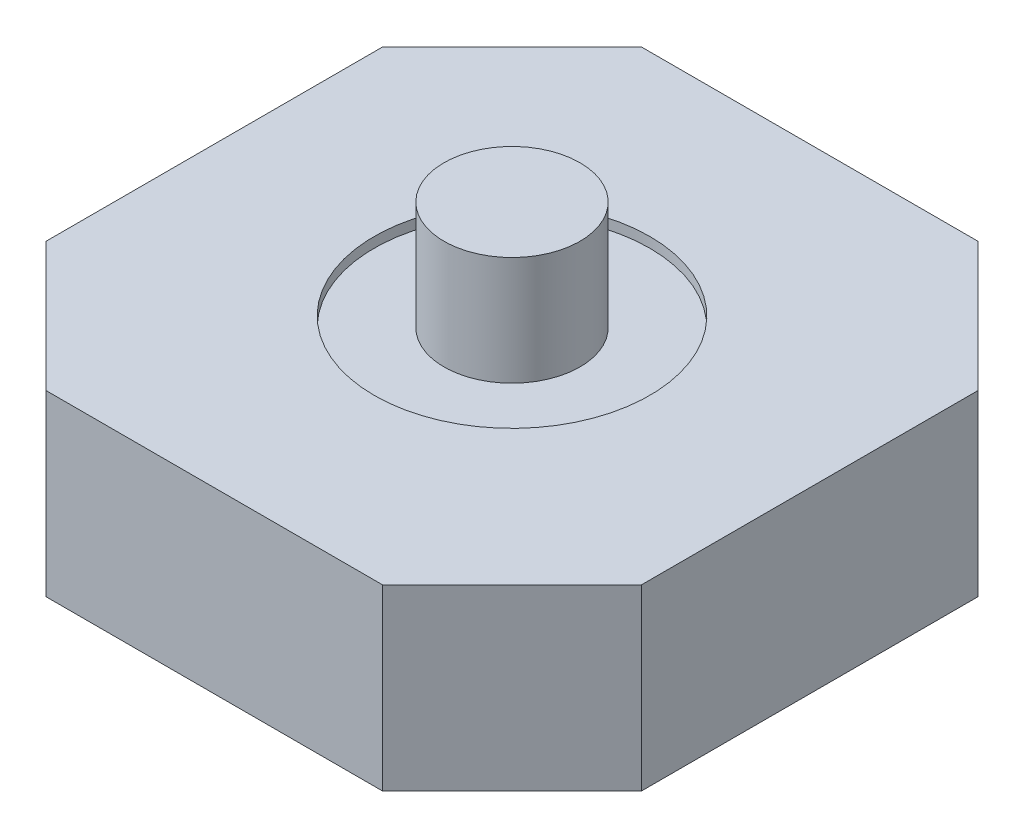
ISO-10303-21;
HEADER;
FILE_DESCRIPTION(('STEP AP214'),'2;1');
FILE_NAME('part.step','',(''),(''),'','','');
FILE_SCHEMA(('AUTOMOTIVE_DESIGN { 1 0 10303 214 1 1 1 1 }'));
ENDSEC;
DATA;
#1=APPLICATION_CONTEXT('core data for automotive mechanical design processes');
#2=APPLICATION_PROTOCOL_DEFINITION('international standard','automotive_design',2000,#1);
#3=PRODUCT_CONTEXT('',#1,'mechanical');
#4=PRODUCT('Part','Part','',(#3));
#5=PRODUCT_RELATED_PRODUCT_CATEGORY('part','',(#4));
#6=PRODUCT_DEFINITION_FORMATION('','',#4);
#7=PRODUCT_DEFINITION_CONTEXT('part definition',#1,'design');
#8=PRODUCT_DEFINITION('design','',#6,#7);
#9=PRODUCT_DEFINITION_SHAPE('','',#8);
#10=(LENGTH_UNIT() NAMED_UNIT(*) SI_UNIT(.MILLI.,.METRE.));
#11=(NAMED_UNIT(*) PLANE_ANGLE_UNIT() SI_UNIT($,.RADIAN.));
#12=(NAMED_UNIT(*) SI_UNIT($,.STERADIAN.) SOLID_ANGLE_UNIT());
#13=UNCERTAINTY_MEASURE_WITH_UNIT(LENGTH_MEASURE(1.E-05),#10,'distance_accuracy_value','');
#14=(GEOMETRIC_REPRESENTATION_CONTEXT(3) GLOBAL_UNCERTAINTY_ASSIGNED_CONTEXT((#13)) GLOBAL_UNIT_ASSIGNED_CONTEXT((#10,
#11,#12)) REPRESENTATION_CONTEXT('',''));
#15=CARTESIAN_POINT('',(0.,0.,0.));
#16=DIRECTION('',(0.,0.,1.));
#17=DIRECTION('',(1.,0.,0.));
#18=AXIS2_PLACEMENT_3D('',#15,#16,#17);
#19=CARTESIAN_POINT('',(-15.78143071355,8.15,-21.64323730767));
#20=DIRECTION('',(0.,1.,0.));
#21=DIRECTION('',(0.,0.,1.));
#22=AXIS2_PLACEMENT_3D('',#19,#20,#21);
#23=PLANE('',#22);
#24=CARTESIAN_POINT('',(-15.78143071355,8.15,-21.64323730767));
#25=DIRECTION('',(0.,-1.,0.));
#26=DIRECTION('',(0.,0.,-1.));
#27=AXIS2_PLACEMENT_3D('',#24,#25,#26);
#28=CIRCLE('',#27,2.);
#29=CARTESIAN_POINT('',(-15.78143071355,8.15,-23.64323730767));
#30=VERTEX_POINT('',#29);
#31=EDGE_CURVE('E19',#30,#30,#28,.T.);
#32=ORIENTED_EDGE('',*,*,#31,.F.);
#33=EDGE_LOOP('',(#32));
#34=FACE_BOUND('',#33,.T.);
#35=ADVANCED_FACE('F16',(#34),#23,.T.);
#36=CARTESIAN_POINT('',(-15.78143071355,8.15,-21.64323730767));
#37=DIRECTION('',(0.,-1.,0.));
#38=DIRECTION('',(0.,0.,-1.));
#39=AXIS2_PLACEMENT_3D('',#36,#37,#38);
#40=CYLINDRICAL_SURFACE('',#39,2.);
#41=CARTESIAN_POINT('',(-15.78143071355,4.95,-21.64323730767));
#42=DIRECTION('',(0.,-1.,0.));
#43=DIRECTION('',(0.,0.,-1.));
#44=AXIS2_PLACEMENT_3D('',#41,#42,#43);
#45=CIRCLE('',#44,2.);
#46=CARTESIAN_POINT('',(-15.78143071355,4.95,-23.64323730767));
#47=VERTEX_POINT('',#46);
#48=EDGE_CURVE('E109',#47,#47,#45,.T.);
#49=ORIENTED_EDGE('',*,*,#48,.F.);
#50=EDGE_LOOP('',(#49));
#51=FACE_BOUND('',#50,.T.);
#52=ORIENTED_EDGE('',*,*,#31,.T.);
#53=EDGE_LOOP('',(#52));
#54=FACE_BOUND('',#53,.T.);
#55=ADVANCED_FACE('F116',(#51,#54),#40,.T.);
#56=CARTESIAN_POINT('',(-15.78143071355,4.95,-21.64323730767));
#57=DIRECTION('',(0.,1.,0.));
#58=DIRECTION('',(0.,0.,1.));
#59=AXIS2_PLACEMENT_3D('',#56,#57,#58);
#60=PLANE('',#59);
#61=CARTESIAN_POINT('',(-15.78143071355,4.95,-21.64323730767));
#62=DIRECTION('',(0.,1.,0.));
#63=DIRECTION('',(0.,0.,1.));
#64=AXIS2_PLACEMENT_3D('',#61,#62,#63);
#65=CIRCLE('',#64,4.05);
#66=CARTESIAN_POINT('',(-15.78143071355,4.95,-17.59323730767));
#67=VERTEX_POINT('',#66);
#68=EDGE_CURVE('E107',#67,#67,#65,.T.);
#69=ORIENTED_EDGE('',*,*,#68,.T.);
#70=EDGE_LOOP('',(#69));
#71=FACE_BOUND('',#70,.T.);
#72=ORIENTED_EDGE('',*,*,#48,.T.);
#73=EDGE_LOOP('',(#72));
#74=FACE_BOUND('',#73,.T.);
#75=ADVANCED_FACE('F123',(#71,#74),#60,.T.);
#76=CARTESIAN_POINT('',(-15.78143071355,4.95,-21.64323730767));
#77=DIRECTION('',(0.,1.,0.));
#78=DIRECTION('',(0.,0.,1.));
#79=AXIS2_PLACEMENT_3D('',#76,#77,#78);
#80=CYLINDRICAL_SURFACE('',#79,4.05);
#81=CARTESIAN_POINT('',(-15.78143071355,5.25,-21.64323730767));
#82=DIRECTION('',(0.,1.,0.));
#83=DIRECTION('',(0.,0.,1.));
#84=AXIS2_PLACEMENT_3D('',#81,#82,#83);
#85=CIRCLE('',#84,4.05);
#86=CARTESIAN_POINT('',(-15.78143071355,5.25,-17.59323730767));
#87=VERTEX_POINT('',#86);
#88=EDGE_CURVE('E90',#87,#87,#85,.F.);
#89=ORIENTED_EDGE('',*,*,#88,.F.);
#90=EDGE_LOOP('',(#89));
#91=FACE_BOUND('',#90,.T.);
#92=ORIENTED_EDGE('',*,*,#68,.F.);
#93=EDGE_LOOP('',(#92));
#94=FACE_BOUND('',#93,.T.);
#95=ADVANCED_FACE('F162',(#91,#94),#80,.F.);
#96=CARTESIAN_POINT('',(0.,5.25,0.));
#97=DIRECTION('',(0.,1.,0.));
#98=DIRECTION('',(0.,0.,1.));
#99=AXIS2_PLACEMENT_3D('',#96,#97,#98);
#100=PLANE('',#99);
#101=DIRECTION('',(0.,0.,1.));
#102=VECTOR('',#101,1.);
#103=CARTESIAN_POINT('',(-7.031430713558,5.25,-12.89323730767));
#104=LINE('',#103,#102);
#105=CARTESIAN_POINT('',(-7.031430713558,5.25,-16.69323730767));
#106=VERTEX_POINT('',#105);
#107=CARTESIAN_POINT('',(-7.031430713557,5.25,-26.593237307671));
#108=VERTEX_POINT('',#107);
#109=EDGE_CURVE('E292',#106,#108,#104,.F.);
#110=ORIENTED_EDGE('',*,*,#109,.T.);
#111=DIRECTION('',(0.707106781186548,0.,0.707106781186548));
#112=VECTOR('',#111,1.);
#113=CARTESIAN_POINT('',(-10.83143071355,5.25,-30.39323730767));
#114=LINE('',#113,#112);
#115=CARTESIAN_POINT('',(-10.83143071355,5.25,-30.39323730767));
#116=VERTEX_POINT('',#115);
#117=EDGE_CURVE('E287',#108,#116,#114,.F.);
#118=ORIENTED_EDGE('',*,*,#117,.T.);
#119=DIRECTION('',(1.,0.,0.));
#120=VECTOR('',#119,1.);
#121=CARTESIAN_POINT('',(-7.031430713558,5.25,-30.39323730767));
#122=LINE('',#121,#120);
#123=CARTESIAN_POINT('',(-20.73143071355,5.25,-30.39323730767));
#124=VERTEX_POINT('',#123);
#125=EDGE_CURVE('E282',#116,#124,#122,.F.);
#126=ORIENTED_EDGE('',*,*,#125,.T.);
#127=DIRECTION('',(0.707106781186548,0.,-0.707106781186548));
#128=VECTOR('',#127,1.);
#129=CARTESIAN_POINT('',(-24.53143071355,5.25,-26.59323730767));
#130=LINE('',#129,#128);
#131=CARTESIAN_POINT('',(-24.53143071355,5.25,-26.59323730767));
#132=VERTEX_POINT('',#131);
#133=EDGE_CURVE('E277',#124,#132,#130,.F.);
#134=ORIENTED_EDGE('',*,*,#133,.T.);
#135=DIRECTION('',(0.,0.,-1.));
#136=VECTOR('',#135,1.);
#137=CARTESIAN_POINT('',(-24.53143071355,5.25,-12.89323730767));
#138=LINE('',#137,#136);
#139=CARTESIAN_POINT('',(-24.53143071355,5.25,-16.69323730767));
#140=VERTEX_POINT('',#139);
#141=EDGE_CURVE('E84',#132,#140,#138,.F.);
#142=ORIENTED_EDGE('',*,*,#141,.T.);
#143=DIRECTION('',(-0.707106781186548,0.,-0.707106781186548));
#144=VECTOR('',#143,1.);
#145=CARTESIAN_POINT('',(-20.73143071355,5.25,-12.89323730767));
#146=LINE('',#145,#144);
#147=CARTESIAN_POINT('',(-20.73143071355,5.25,-12.89323730767));
#148=VERTEX_POINT('',#147);
#149=EDGE_CURVE('E81',#140,#148,#146,.F.);
#150=ORIENTED_EDGE('',*,*,#149,.T.);
#151=DIRECTION('',(-1.,0.,0.));
#152=VECTOR('',#151,1.);
#153=CARTESIAN_POINT('',(-7.031430713558,5.25,-12.89323730767));
#154=LINE('',#153,#152);
#155=CARTESIAN_POINT('',(-10.831430713551,5.25,-12.893237307671));
#156=VERTEX_POINT('',#155);
#157=EDGE_CURVE('E78',#148,#156,#154,.F.);
#158=ORIENTED_EDGE('',*,*,#157,.T.);
#159=DIRECTION('',(-0.707106781186548,0.,0.707106781186548));
#160=VECTOR('',#159,1.);
#161=CARTESIAN_POINT('',(-7.031430713558,5.25,-16.69323730767));
#162=LINE('',#161,#160);
#163=EDGE_CURVE('E262',#156,#106,#162,.F.);
#164=ORIENTED_EDGE('',*,*,#163,.T.);
#165=EDGE_LOOP('',(#110,#118,#126,#134,#142,#150,#158,#164));
#166=FACE_BOUND('',#165,.T.);
#167=ORIENTED_EDGE('',*,*,#88,.T.);
#168=EDGE_LOOP('',(#167));
#169=FACE_BOUND('',#168,.T.);
#170=ADVANCED_FACE('F82',(#166,#169),#100,.T.);
#171=CARTESIAN_POINT('',(-20.73143071355,5.25,-12.89323730767));
#172=DIRECTION('',(0.707106781186548,0.,-0.707106781186548));
#173=DIRECTION('',(-0.707106781186548,0.,-0.707106781186548));
#174=AXIS2_PLACEMENT_3D('',#171,#172,#173);
#175=PLANE('',#174);
#176=DIRECTION('',(0.,1.,0.));
#177=VECTOR('',#176,1.);
#178=CARTESIAN_POINT('',(-24.53143071355,5.25,-16.69323730767));
#179=LINE('',#178,#177);
#180=CARTESIAN_POINT('',(-24.53143071355,0.,-16.69323730767));
#181=VERTEX_POINT('',#180);
#182=EDGE_CURVE('E275',#140,#181,#179,.F.);
#183=ORIENTED_EDGE('',*,*,#182,.T.);
#184=DIRECTION('',(0.707106781186548,0.,0.707106781186547));
#185=VECTOR('',#184,1.);
#186=CARTESIAN_POINT('',(-24.53143071355,0.,-16.69323730767));
#187=LINE('',#186,#185);
#188=CARTESIAN_POINT('',(-20.73143071355,0.,-12.89323730767));
#189=VERTEX_POINT('',#188);
#190=EDGE_CURVE('E101',#181,#189,#187,.T.);
#191=ORIENTED_EDGE('',*,*,#190,.T.);
#192=DIRECTION('',(0.,1.,0.));
#193=VECTOR('',#192,1.);
#194=CARTESIAN_POINT('',(-20.73143071355,5.25,-12.89323730767));
#195=LINE('',#194,#193);
#196=EDGE_CURVE('E89',#189,#148,#195,.T.);
#197=ORIENTED_EDGE('',*,*,#196,.T.);
#198=ORIENTED_EDGE('',*,*,#149,.F.);
#199=EDGE_LOOP('',(#183,#191,#197,#198));
#200=FACE_BOUND('',#199,.T.);
#201=ADVANCED_FACE('F100',(#200),#175,.F.);
#202=CARTESIAN_POINT('',(-7.031430713558,5.25,-12.89323730767));
#203=DIRECTION('',(0.,0.,-1.));
#204=DIRECTION('',(-1.,0.,0.));
#205=AXIS2_PLACEMENT_3D('',#202,#203,#204);
#206=PLANE('',#205);
#207=ORIENTED_EDGE('',*,*,#196,.F.);
#208=DIRECTION('',(1.,0.,0.));
#209=VECTOR('',#208,1.);
#210=CARTESIAN_POINT('',(0.,0.,-12.89323730767));
#211=LINE('',#210,#209);
#212=CARTESIAN_POINT('',(-10.831430713551,0.,-12.893237307671));
#213=VERTEX_POINT('',#212);
#214=EDGE_CURVE('E264',#189,#213,#211,.T.);
#215=ORIENTED_EDGE('',*,*,#214,.T.);
#216=DIRECTION('',(0.,1.,0.));
#217=VECTOR('',#216,1.);
#218=CARTESIAN_POINT('',(-10.831430713554,5.25,-12.893237307674));
#219=LINE('',#218,#217);
#220=EDGE_CURVE('E97',#213,#156,#219,.T.);
#221=ORIENTED_EDGE('',*,*,#220,.T.);
#222=ORIENTED_EDGE('',*,*,#157,.F.);
#223=EDGE_LOOP('',(#207,#215,#221,#222));
#224=FACE_BOUND('',#223,.T.);
#225=ADVANCED_FACE('F94',(#224),#206,.F.);
#226=CARTESIAN_POINT('',(-7.031430713558,5.25,-16.69323730767));
#227=DIRECTION('',(-0.707106781186548,0.,-0.707106781186548));
#228=DIRECTION('',(-0.707106781186548,0.,0.707106781186548));
#229=AXIS2_PLACEMENT_3D('',#226,#227,#228);
#230=PLANE('',#229);
#231=ORIENTED_EDGE('',*,*,#220,.F.);
#232=DIRECTION('',(0.707106781185803,0.,-0.707106781187292));
#233=VECTOR('',#232,1.);
#234=CARTESIAN_POINT('',(-10.83143071355,0.,-12.89323730767));
#235=LINE('',#234,#233);
#236=CARTESIAN_POINT('',(-7.031430713558,0.,-16.69323730767));
#237=VERTEX_POINT('',#236);
#238=EDGE_CURVE('E261',#213,#237,#235,.T.);
#239=ORIENTED_EDGE('',*,*,#238,.T.);
#240=DIRECTION('',(0.,1.,0.));
#241=VECTOR('',#240,1.);
#242=CARTESIAN_POINT('',(-7.031430713558,5.25,-16.69323730767));
#243=LINE('',#242,#241);
#244=EDGE_CURVE('E294',#237,#106,#243,.T.);
#245=ORIENTED_EDGE('',*,*,#244,.T.);
#246=ORIENTED_EDGE('',*,*,#163,.F.);
#247=EDGE_LOOP('',(#231,#239,#245,#246));
#248=FACE_BOUND('',#247,.T.);
#249=ADVANCED_FACE('F151',(#248),#230,.F.);
#250=CARTESIAN_POINT('',(-7.031430713558,5.25,-12.89323730767));
#251=DIRECTION('',(-1.,0.,0.));
#252=DIRECTION('',(0.,0.,1.));
#253=AXIS2_PLACEMENT_3D('',#250,#251,#252);
#254=PLANE('',#253);
#255=DIRECTION('',(0.,1.,0.));
#256=VECTOR('',#255,1.);
#257=CARTESIAN_POINT('',(-7.031430713554,5.25,-26.593237307674));
#258=LINE('',#257,#256);
#259=CARTESIAN_POINT('',(-7.031430713557,0.,-26.593237307671));
#260=VERTEX_POINT('',#259);
#261=EDGE_CURVE('E289',#260,#108,#258,.T.);
#262=ORIENTED_EDGE('',*,*,#261,.T.);
#263=ORIENTED_EDGE('',*,*,#109,.F.);
#264=ORIENTED_EDGE('',*,*,#244,.F.);
#265=DIRECTION('',(0.,0.,1.));
#266=VECTOR('',#265,1.);
#267=CARTESIAN_POINT('',(-7.031430713558,0.,0.));
#268=LINE('',#267,#266);
#269=EDGE_CURVE('E267',#237,#260,#268,.F.);
#270=ORIENTED_EDGE('',*,*,#269,.T.);
#271=EDGE_LOOP('',(#262,#263,#264,#270));
#272=FACE_BOUND('',#271,.T.);
#273=ADVANCED_FACE('F147',(#272),#254,.F.);
#274=CARTESIAN_POINT('',(-10.83143071355,5.25,-30.39323730767));
#275=DIRECTION('',(-0.707106781186548,0.,0.707106781186548));
#276=DIRECTION('',(0.707106781186548,0.,0.707106781186548));
#277=AXIS2_PLACEMENT_3D('',#274,#275,#276);
#278=PLANE('',#277);
#279=ORIENTED_EDGE('',*,*,#261,.F.);
#280=DIRECTION('',(-0.707106781185804,0.,-0.707106781187292));
#281=VECTOR('',#280,1.);
#282=CARTESIAN_POINT('',(-7.031430713558,0.,-26.59323730767));
#283=LINE('',#282,#281);
#284=CARTESIAN_POINT('',(-10.83143071355,0.,-30.39323730767));
#285=VERTEX_POINT('',#284);
#286=EDGE_CURVE('E299',#260,#285,#283,.T.);
#287=ORIENTED_EDGE('',*,*,#286,.T.);
#288=DIRECTION('',(0.,1.,0.));
#289=VECTOR('',#288,1.);
#290=CARTESIAN_POINT('',(-10.83143071355,5.25,-30.39323730767));
#291=LINE('',#290,#289);
#292=EDGE_CURVE('E284',#285,#116,#291,.T.);
#293=ORIENTED_EDGE('',*,*,#292,.T.);
#294=ORIENTED_EDGE('',*,*,#117,.F.);
#295=EDGE_LOOP('',(#279,#287,#293,#294));
#296=FACE_BOUND('',#295,.T.);
#297=ADVANCED_FACE('F143',(#296),#278,.F.);
#298=CARTESIAN_POINT('',(-7.031430713558,5.25,-30.39323730767));
#299=DIRECTION('',(0.,0.,1.));
#300=DIRECTION('',(1.,0.,0.));
#301=AXIS2_PLACEMENT_3D('',#298,#299,#300);
#302=PLANE('',#301);
#303=DIRECTION('',(0.,1.,0.));
#304=VECTOR('',#303,1.);
#305=CARTESIAN_POINT('',(-20.73143071355,5.25,-30.39323730767));
#306=LINE('',#305,#304);
#307=CARTESIAN_POINT('',(-20.73143071355,0.,-30.39323730767));
#308=VERTEX_POINT('',#307);
#309=EDGE_CURVE('E279',#308,#124,#306,.T.);
#310=ORIENTED_EDGE('',*,*,#309,.T.);
#311=ORIENTED_EDGE('',*,*,#125,.F.);
#312=ORIENTED_EDGE('',*,*,#292,.F.);
#313=DIRECTION('',(1.,0.,0.));
#314=VECTOR('',#313,1.);
#315=CARTESIAN_POINT('',(0.,0.,-30.39323730767));
#316=LINE('',#315,#314);
#317=EDGE_CURVE('E302',#285,#308,#316,.F.);
#318=ORIENTED_EDGE('',*,*,#317,.T.);
#319=EDGE_LOOP('',(#310,#311,#312,#318));
#320=FACE_BOUND('',#319,.T.);
#321=ADVANCED_FACE('F139',(#320),#302,.F.);
#322=CARTESIAN_POINT('',(-24.53143071355,5.25,-26.59323730767));
#323=DIRECTION('',(0.707106781186548,0.,0.707106781186548));
#324=DIRECTION('',(0.707106781186548,0.,-0.707106781186548));
#325=AXIS2_PLACEMENT_3D('',#322,#323,#324);
#326=PLANE('',#325);
#327=ORIENTED_EDGE('',*,*,#309,.F.);
#328=DIRECTION('',(-0.707106781186548,0.,0.707106781186547));
#329=VECTOR('',#328,1.);
#330=CARTESIAN_POINT('',(-20.73143071355,0.,-30.39323730767));
#331=LINE('',#330,#329);
#332=CARTESIAN_POINT('',(-24.53143071355,0.,-26.59323730767));
#333=VERTEX_POINT('',#332);
#334=EDGE_CURVE('E25',#308,#333,#331,.T.);
#335=ORIENTED_EDGE('',*,*,#334,.T.);
#336=DIRECTION('',(0.,1.,0.));
#337=VECTOR('',#336,1.);
#338=CARTESIAN_POINT('',(-24.53143071355,5.25,-26.59323730767));
#339=LINE('',#338,#337);
#340=EDGE_CURVE('E33',#333,#132,#339,.T.);
#341=ORIENTED_EDGE('',*,*,#340,.T.);
#342=ORIENTED_EDGE('',*,*,#133,.F.);
#343=EDGE_LOOP('',(#327,#335,#341,#342));
#344=FACE_BOUND('',#343,.T.);
#345=ADVANCED_FACE('F133',(#344),#326,.F.);
#346=CARTESIAN_POINT('',(-24.53143071355,5.25,-12.89323730767));
#347=DIRECTION('',(1.,0.,0.));
#348=DIRECTION('',(0.,0.,-1.));
#349=AXIS2_PLACEMENT_3D('',#346,#347,#348);
#350=PLANE('',#349);
#351=ORIENTED_EDGE('',*,*,#340,.F.);
#352=DIRECTION('',(0.,0.,1.));
#353=VECTOR('',#352,1.);
#354=CARTESIAN_POINT('',(-24.53143071355,0.,0.));
#355=LINE('',#354,#353);
#356=EDGE_CURVE('E11',#333,#181,#355,.T.);
#357=ORIENTED_EDGE('',*,*,#356,.T.);
#358=ORIENTED_EDGE('',*,*,#182,.F.);
#359=ORIENTED_EDGE('',*,*,#141,.F.);
#360=EDGE_LOOP('',(#351,#357,#358,#359));
#361=FACE_BOUND('',#360,.T.);
#362=ADVANCED_FACE('F127',(#361),#350,.F.);
#363=CARTESIAN_POINT('',(0.,0.,0.));
#364=DIRECTION('',(0.,1.,0.));
#365=DIRECTION('',(0.,0.,1.));
#366=AXIS2_PLACEMENT_3D('',#363,#364,#365);
#367=PLANE('',#366);
#368=ORIENTED_EDGE('',*,*,#334,.F.);
#369=ORIENTED_EDGE('',*,*,#317,.F.);
#370=ORIENTED_EDGE('',*,*,#286,.F.);
#371=ORIENTED_EDGE('',*,*,#269,.F.);
#372=ORIENTED_EDGE('',*,*,#238,.F.);
#373=ORIENTED_EDGE('',*,*,#214,.F.);
#374=ORIENTED_EDGE('',*,*,#190,.F.);
#375=ORIENTED_EDGE('',*,*,#356,.F.);
#376=EDGE_LOOP('',(#368,#369,#370,#371,#372,#373,#374,#375));
#377=FACE_BOUND('',#376,.T.);
#378=ADVANCED_FACE('F125',(#377),#367,.F.);
#379=CLOSED_SHELL('',(#35,#55,#75,#95,#170,#201,#225,#249,#273,#297,#321,#345,#362,#378));
#380=MANIFOLD_SOLID_BREP('B1',#379);
#381=ADVANCED_BREP_SHAPE_REPRESENTATION('',(#18,#380),#14);
#382=SHAPE_DEFINITION_REPRESENTATION(#9,#381);
ENDSEC;
END-ISO-10303-21;
